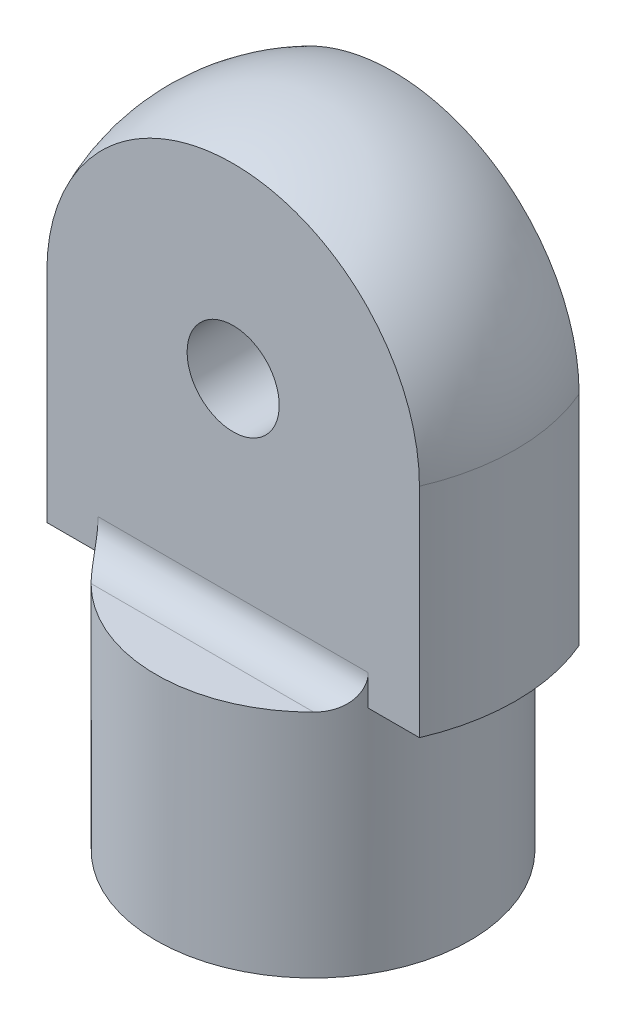
ISO-10303-21;
HEADER;
FILE_DESCRIPTION(('STEP AP214'),'2;1');
FILE_NAME('part.step','',(''),(''),'','','');
FILE_SCHEMA(('AUTOMOTIVE_DESIGN { 1 0 10303 214 1 1 1 1 }'));
ENDSEC;
DATA;
#1=APPLICATION_CONTEXT('core data for automotive mechanical design processes');
#2=APPLICATION_PROTOCOL_DEFINITION('international standard','automotive_design',2000,#1);
#3=PRODUCT_CONTEXT('',#1,'mechanical');
#4=PRODUCT('Part','Part','',(#3));
#5=PRODUCT_RELATED_PRODUCT_CATEGORY('part','',(#4));
#6=PRODUCT_DEFINITION_FORMATION('','',#4);
#7=PRODUCT_DEFINITION_CONTEXT('part definition',#1,'design');
#8=PRODUCT_DEFINITION('design','',#6,#7);
#9=PRODUCT_DEFINITION_SHAPE('','',#8);
#10=(LENGTH_UNIT() NAMED_UNIT(*) SI_UNIT(.MILLI.,.METRE.));
#11=(NAMED_UNIT(*) PLANE_ANGLE_UNIT() SI_UNIT($,.RADIAN.));
#12=(NAMED_UNIT(*) SI_UNIT($,.STERADIAN.) SOLID_ANGLE_UNIT());
#13=UNCERTAINTY_MEASURE_WITH_UNIT(LENGTH_MEASURE(1.E-05),#10,'distance_accuracy_value','');
#14=(GEOMETRIC_REPRESENTATION_CONTEXT(3) GLOBAL_UNCERTAINTY_ASSIGNED_CONTEXT((#13)) GLOBAL_UNIT_ASSIGNED_CONTEXT((#10,
#11,#12)) REPRESENTATION_CONTEXT('',''));
#15=CARTESIAN_POINT('',(0.,0.,0.));
#16=DIRECTION('',(0.,0.,1.));
#17=DIRECTION('',(1.,0.,0.));
#18=AXIS2_PLACEMENT_3D('',#15,#16,#17);
#19=CARTESIAN_POINT('',(0.,19.05,0.));
#20=DIRECTION('',(0.,-1.,0.));
#21=DIRECTION('',(0.,0.,-1.));
#22=AXIS2_PLACEMENT_3D('',#19,#20,#21);
#23=CYLINDRICAL_SURFACE('',#22,16.764);
#24=CARTESIAN_POINT('',(0.,37.0615688143395,0.));
#25=DIRECTION('',(0.,-1.,0.));
#26=DIRECTION('',(0.,0.,-1.));
#27=AXIS2_PLACEMENT_3D('',#24,#25,#26);
#28=CIRCLE('',#27,16.764);
#29=CARTESIAN_POINT('',(15.4084029023128,37.0615688143395,-6.604));
#30=VERTEX_POINT('',#29);
#31=CARTESIAN_POINT('',(15.4084029023128,37.0615688143395,6.604));
#32=VERTEX_POINT('',#31);
#33=EDGE_CURVE('E150',#30,#32,#28,.T.);
#34=ORIENTED_EDGE('',*,*,#33,.T.);
#35=DIRECTION('',(0.,-1.,0.));
#36=VECTOR('',#35,1.);
#37=CARTESIAN_POINT('',(15.4084029023127,19.05,6.604));
#38=LINE('',#37,#36);
#39=CARTESIAN_POINT('',(15.4084029023128,19.05,6.604));
#40=VERTEX_POINT('',#39);
#41=EDGE_CURVE('E142',#32,#40,#38,.T.);
#42=ORIENTED_EDGE('',*,*,#41,.T.);
#43=CARTESIAN_POINT('',(0.,19.05,0.));
#44=DIRECTION('',(0.,-1.,0.));
#45=DIRECTION('',(0.,0.,-1.));
#46=AXIS2_PLACEMENT_3D('',#43,#44,#45);
#47=CIRCLE('',#46,16.764);
#48=CARTESIAN_POINT('',(15.4084029023128,19.05,-6.604));
#49=VERTEX_POINT('',#48);
#50=EDGE_CURVE('E141',#49,#40,#47,.T.);
#51=ORIENTED_EDGE('',*,*,#50,.F.);
#52=DIRECTION('',(0.,-1.,0.));
#53=VECTOR('',#52,1.);
#54=CARTESIAN_POINT('',(15.4084029023128,19.05,-6.604));
#55=LINE('',#54,#53);
#56=EDGE_CURVE('E168',#49,#30,#55,.F.);
#57=ORIENTED_EDGE('',*,*,#56,.T.);
#58=EDGE_LOOP('',(#34,#42,#51,#57));
#59=FACE_BOUND('',#58,.T.);
#60=ADVANCED_FACE('F33',(#59),#23,.T.);
#61=CARTESIAN_POINT('',(0.,19.05,16.764));
#62=DIRECTION('',(0.,1.,0.));
#63=DIRECTION('',(0.,0.,1.));
#64=AXIS2_PLACEMENT_3D('',#61,#62,#63);
#65=PLANE('',#64);
#66=ORIENTED_EDGE('',*,*,#50,.T.);
#67=DIRECTION('',(-1.,0.,0.));
#68=VECTOR('',#67,1.);
#69=CARTESIAN_POINT('',(0.,19.05,6.604));
#70=LINE('',#69,#68);
#71=CARTESIAN_POINT('',(11.1737195400636,19.05,6.604));
#72=VERTEX_POINT('',#71);
#73=EDGE_CURVE('E164',#40,#72,#70,.T.);
#74=ORIENTED_EDGE('',*,*,#73,.T.);
#75=CARTESIAN_POINT('',(0.,19.05,0.));
#76=DIRECTION('',(0.,1.,0.));
#77=DIRECTION('',(0.,0.,1.));
#78=AXIS2_PLACEMENT_3D('',#75,#76,#77);
#79=CIRCLE('',#78,12.9794);
#80=CARTESIAN_POINT('',(11.1737195400636,19.05,-6.604));
#81=VERTEX_POINT('',#80);
#82=EDGE_CURVE('E154',#72,#81,#79,.T.);
#83=ORIENTED_EDGE('',*,*,#82,.T.);
#84=DIRECTION('',(1.,0.,0.));
#85=VECTOR('',#84,1.);
#86=CARTESIAN_POINT('',(0.,19.05,-6.604));
#87=LINE('',#86,#85);
#88=EDGE_CURVE('E126',#81,#49,#87,.T.);
#89=ORIENTED_EDGE('',*,*,#88,.T.);
#90=EDGE_LOOP('',(#66,#74,#83,#89));
#91=FACE_BOUND('',#90,.T.);
#92=ADVANCED_FACE('F215',(#91),#65,.F.);
#93=CARTESIAN_POINT('',(0.,19.05,0.));
#94=DIRECTION('',(0.,-1.,0.));
#95=DIRECTION('',(0.,0.,-1.));
#96=AXIS2_PLACEMENT_3D('',#93,#94,#95);
#97=CYLINDRICAL_SURFACE('',#96,12.9794);
#98=ORIENTED_EDGE('',*,*,#82,.F.);
#99=DIRECTION('',(0.,-1.,0.));
#100=VECTOR('',#99,1.);
#101=CARTESIAN_POINT('',(11.1737195400636,21.59,6.604));
#102=LINE('',#101,#100);
#103=CARTESIAN_POINT('',(11.1737195400636,21.59,6.604));
#104=VERTEX_POINT('',#103);
#105=EDGE_CURVE('E181',#104,#72,#102,.T.);
#106=ORIENTED_EDGE('',*,*,#105,.F.);
#107=CARTESIAN_POINT('',(11.1737195400636,21.59,6.604));
#108=CARTESIAN_POINT('',(11.1737215733515,21.5265407898862,6.60398935535812));
#109=CARTESIAN_POINT('',(11.1723139936164,21.4630864801311,6.60637795087207));
#110=CARTESIAN_POINT('',(11.1666963441772,21.3366709381351,6.61587278710055));
#111=CARTESIAN_POINT('',(11.1624869220927,21.2737095953514,6.62297793762664));
#112=CARTESIAN_POINT('',(11.1513017591938,21.1489504417422,6.64179240239289));
#113=CARTESIAN_POINT('',(11.1443356727992,21.0871493503745,6.65348564696111));
#114=CARTESIAN_POINT('',(11.1276762898658,20.9649460750755,6.68131021117566));
#115=CARTESIAN_POINT('',(11.1179829382894,20.9045439194022,6.69744162038615));
#116=CARTESIAN_POINT('',(11.0848786639251,20.7261176073252,6.75219441986443));
#117=CARTESIAN_POINT('',(11.0574288381731,20.6107096382099,6.79719969802229));
#118=CARTESIAN_POINT('',(10.9923119638442,20.3899868127129,6.90200567936843));
#119=CARTESIAN_POINT('',(10.9546388597796,20.2846779884856,6.96181514957632));
#120=CARTESIAN_POINT('',(10.868260768231,20.0825992792861,7.09593558962988));
#121=CARTESIAN_POINT('',(10.8192056770615,19.986276734222,7.17069328137976));
#122=CARTESIAN_POINT('',(10.711920094414,19.8080683149321,7.3299936146215));
#123=CARTESIAN_POINT('',(10.6536912808835,19.7261798063974,7.41453446594564));
#124=CARTESIAN_POINT('',(10.5217333092046,19.5684150280978,7.60081929226967));
#125=CARTESIAN_POINT('',(10.4469848013716,19.4944044493318,7.70341431990763));
#126=CARTESIAN_POINT('',(10.2886983969578,19.3644651551549,7.91358730874569));
#127=CARTESIAN_POINT('',(10.2051369600394,19.3085865807153,8.02117816275038));
#128=CARTESIAN_POINT('',(10.0494506022818,19.2241724965358,8.21494931286933));
#129=CARTESIAN_POINT('',(9.97867343952245,19.1923491538254,8.30081620902634));
#130=CARTESIAN_POINT('',(9.83327244307778,19.138701463706,8.47255846015439));
#131=CARTESIAN_POINT('',(9.75864483265789,19.1168871493993,8.55843373768028));
#132=CARTESIAN_POINT('',(9.60666075751741,19.0826888564086,8.72867815152028));
#133=CARTESIAN_POINT('',(9.52932284208018,19.0702503764724,8.81305316427712));
#134=CARTESIAN_POINT('',(9.37217962608396,19.05391922019,8.97999327389157));
#135=CARTESIAN_POINT('',(9.29237989759662,19.0500085020063,9.06256182524474));
#136=CARTESIAN_POINT('',(9.21151932962202,19.05,9.144));
#137=B_SPLINE_CURVE_WITH_KNOTS('',3,(#107,#108,#109,#110,#111,#112,#113,#114,#115,#116,#117,
#118,#119,#120,#121,#122,#123,#124,#125,#126,#127,#128,#129,#130,#131,#132,#133,#134,#135,#136),
.UNSPECIFIED.,.F.,.F.,(4,2,2,2,2,2,2,2,2,2,2,2,2,2,4),(0.,0.19030876138845,0.380573549960749,
0.570177806057979,0.759785888735379,1.13850876554972,1.51745646031555,1.91012743967642,
2.30272667956841,2.74190052029378,3.18227867186928,3.52899062172235,3.87604936220698,
4.2210747704534,4.56536951142442),.UNSPECIFIED.);
#138=CARTESIAN_POINT('',(9.21151932962202,19.05,9.144));
#139=VERTEX_POINT('',#138);
#140=EDGE_CURVE('E47',#104,#139,#137,.T.);
#141=ORIENTED_EDGE('',*,*,#140,.T.);
#142=CARTESIAN_POINT('',(-9.21151932962202,19.05,9.144));
#143=VERTEX_POINT('',#142);
#144=EDGE_CURVE('E158',#143,#139,#79,.T.);
#145=ORIENTED_EDGE('',*,*,#144,.F.);
#146=CARTESIAN_POINT('',(-9.21151932962202,19.05,9.144));
#147=CARTESIAN_POINT('',(-9.28684877218685,19.0500070242211,9.06812838961582));
#148=CARTESIAN_POINT('',(-9.36125421929603,19.0534014394328,8.99128449303218));
#149=CARTESIAN_POINT('',(-9.50793080026487,19.0675305394493,8.8360303345306));
#150=CARTESIAN_POINT('',(-9.58019847199863,19.0782765165705,8.75761784331495));
#151=CARTESIAN_POINT('',(-9.72266637939333,19.1077994094863,8.59918793597159));
#152=CARTESIAN_POINT('',(-9.79284453196604,19.1266421091711,8.5191626059475));
#153=CARTESIAN_POINT('',(-9.92996636505326,19.1729314114814,8.35893052525986));
#154=CARTESIAN_POINT('',(-9.99691207814926,19.2003725238575,8.27872392269605));
#155=CARTESIAN_POINT('',(-10.1640706949811,19.2826280271739,8.07356673634664));
#156=CARTESIAN_POINT('',(-10.2616290549579,19.3441415136587,7.94902614628663));
#157=CARTESIAN_POINT('',(-10.4451082201562,19.4912511862041,7.70633488919627));
#158=CARTESIAN_POINT('',(-10.531068941997,19.5767614780111,7.58816319159785));
#159=CARTESIAN_POINT('',(-10.6775928905408,19.7578522180787,7.38021537434764));
#160=CARTESIAN_POINT('',(-10.7400320340918,19.8500562697291,7.28882757391671));
#161=CARTESIAN_POINT('',(-10.8536663020337,20.0516988180007,7.11851394398465));
#162=CARTESIAN_POINT('',(-10.9048573035768,20.1611436088193,7.03959268688868));
#163=CARTESIAN_POINT('',(-10.9723007596352,20.3367614246828,6.93362983124986));
#164=CARTESIAN_POINT('',(-10.9932802587896,20.3974363754101,6.9002862638163));
#165=CARTESIAN_POINT('',(-11.0319282330376,20.5221481047471,6.83832677886499));
#166=CARTESIAN_POINT('',(-11.0495982894036,20.5861832590102,6.80970860430289));
#167=CARTESIAN_POINT('',(-11.0815042760653,20.7170972497852,6.75766390007577));
#168=CARTESIAN_POINT('',(-11.0957427828205,20.7839739081941,6.73423347645025));
#169=CARTESIAN_POINT('',(-11.1207105107784,20.9200216271941,6.69292186249175));
#170=CARTESIAN_POINT('',(-11.1314410139288,20.9891918394395,6.67503864513725));
#171=CARTESIAN_POINT('',(-11.1514639571528,21.1459497216208,6.64154743020641));
#172=CARTESIAN_POINT('',(-11.1598065009689,21.2340030709361,6.62749361298952));
#173=CARTESIAN_POINT('',(-11.1681520890102,21.3670144160924,6.613412764823));
#174=CARTESIAN_POINT('',(-11.1702392472267,21.4115093904322,6.60988579350548));
#175=CARTESIAN_POINT('',(-11.1730227054387,21.5006652748933,6.60517919900973));
#176=CARTESIAN_POINT('',(-11.1737190480764,21.5453261798851,6.60399950386426));
#177=CARTESIAN_POINT('',(-11.1737195400636,21.59,6.604));
#178=B_SPLINE_CURVE_WITH_KNOTS('',3,(#146,#147,#148,#149,#150,#151,#152,#153,#154,#155,#156,
#157,#158,#159,#160,#161,#162,#163,#164,#165,#166,#167,#168,#169,#170,#171,#172,#173,#174,#175,
#176,#177),.UNSPECIFIED.,.F.,.F.,(4,2,2,2,2,2,2,2,2,2,2,2,2,2,2,4),(0.,0.320743055616612,
0.641979895880251,0.965877577140258,1.28956886359833,1.7967531082092,2.3021445966807,
2.73255267181965,3.16311824477273,3.37988810311987,3.59655412176039,3.81305695391256,
4.02948057965427,4.29740703122271,4.43138598643297,4.5653608337986),.UNSPECIFIED.);
#179=CARTESIAN_POINT('',(-11.1737195400636,21.59,6.604));
#180=VERTEX_POINT('',#179);
#181=EDGE_CURVE('E11',#143,#180,#178,.T.);
#182=ORIENTED_EDGE('',*,*,#181,.T.);
#183=DIRECTION('',(0.,-1.,0.));
#184=VECTOR('',#183,1.);
#185=CARTESIAN_POINT('',(-11.1737195400636,19.05,6.604));
#186=LINE('',#185,#184);
#187=CARTESIAN_POINT('',(-11.1737195400636,19.05,6.604));
#188=VERTEX_POINT('',#187);
#189=EDGE_CURVE('E53',#188,#180,#186,.F.);
#190=ORIENTED_EDGE('',*,*,#189,.F.);
#191=CARTESIAN_POINT('',(-11.1737195400636,19.05,-6.604));
#192=VERTEX_POINT('',#191);
#193=EDGE_CURVE('E159',#192,#188,#79,.T.);
#194=ORIENTED_EDGE('',*,*,#193,.F.);
#195=DIRECTION('',(0.,-1.,0.));
#196=VECTOR('',#195,1.);
#197=CARTESIAN_POINT('',(-11.1737195400636,21.59,-6.604));
#198=LINE('',#197,#196);
#199=CARTESIAN_POINT('',(-11.1737195400636,21.59,-6.604));
#200=VERTEX_POINT('',#199);
#201=EDGE_CURVE('E121',#200,#192,#198,.T.);
#202=ORIENTED_EDGE('',*,*,#201,.F.);
#203=CARTESIAN_POINT('',(-11.1737195400636,21.59,-6.604));
#204=CARTESIAN_POINT('',(-11.1737215733515,21.5265407898862,-6.60398935535812));
#205=CARTESIAN_POINT('',(-11.1723139936164,21.4630864801311,-6.60637795087207));
#206=CARTESIAN_POINT('',(-11.1666963441772,21.3366709381351,-6.61587278710055));
#207=CARTESIAN_POINT('',(-11.1624869220927,21.2737095953514,-6.62297793762664));
#208=CARTESIAN_POINT('',(-11.1513017591938,21.1489504417422,-6.64179240239289));
#209=CARTESIAN_POINT('',(-11.1443356727992,21.0871493503745,-6.65348564696111));
#210=CARTESIAN_POINT('',(-11.1276762898658,20.9649460750755,-6.68131021117566));
#211=CARTESIAN_POINT('',(-11.1179829382894,20.9045439194022,-6.69744162038615));
#212=CARTESIAN_POINT('',(-11.0848786639251,20.7261176073252,-6.75219441986443));
#213=CARTESIAN_POINT('',(-11.0574288381731,20.6107096382099,-6.79719969802229));
#214=CARTESIAN_POINT('',(-10.9923119638442,20.3899868127129,-6.90200567936843));
#215=CARTESIAN_POINT('',(-10.9546388597796,20.2846779884856,-6.96181514957632));
#216=CARTESIAN_POINT('',(-10.868260768231,20.0825992792861,-7.09593558962988));
#217=CARTESIAN_POINT('',(-10.8192056770615,19.986276734222,-7.17069328137976));
#218=CARTESIAN_POINT('',(-10.711920094414,19.8080683149321,-7.3299936146215));
#219=CARTESIAN_POINT('',(-10.6536912808835,19.7261798063974,-7.41453446594564));
#220=CARTESIAN_POINT('',(-10.5217333092046,19.5684150280978,-7.60081929226967));
#221=CARTESIAN_POINT('',(-10.4469848013716,19.4944044493318,-7.70341431990763));
#222=CARTESIAN_POINT('',(-10.2886983969578,19.3644651551549,-7.91358730874569));
#223=CARTESIAN_POINT('',(-10.2051369600394,19.3085865807153,-8.02117816275038));
#224=CARTESIAN_POINT('',(-10.0494506022818,19.2241724965358,-8.21494931286933));
#225=CARTESIAN_POINT('',(-9.97867343952245,19.1923491538254,-8.30081620902634));
#226=CARTESIAN_POINT('',(-9.83327244307778,19.138701463706,-8.47255846015439));
#227=CARTESIAN_POINT('',(-9.75864483265789,19.1168871493993,-8.55843373768028));
#228=CARTESIAN_POINT('',(-9.60666075751741,19.0826888564086,-8.72867815152028));
#229=CARTESIAN_POINT('',(-9.52932284208018,19.0702503764724,-8.81305316427712));
#230=CARTESIAN_POINT('',(-9.37217962608396,19.05391922019,-8.97999327389157));
#231=CARTESIAN_POINT('',(-9.29237989759662,19.0500085020063,-9.06256182524474));
#232=CARTESIAN_POINT('',(-9.21151932962202,19.05,-9.144));
#233=B_SPLINE_CURVE_WITH_KNOTS('',3,(#203,#204,#205,#206,#207,#208,#209,#210,#211,#212,#213,
#214,#215,#216,#217,#218,#219,#220,#221,#222,#223,#224,#225,#226,#227,#228,#229,#230,#231,#232),
.UNSPECIFIED.,.F.,.F.,(4,2,2,2,2,2,2,2,2,2,2,2,2,2,4),(0.,0.19030876138845,0.380573549960749,
0.570177806057979,0.759785888735379,1.13850876554972,1.51745646031555,1.91012743967642,
2.30272667956841,2.74190052029378,3.18227867186928,3.52899062172235,3.87604936220698,
4.2210747704534,4.56536951142442),.UNSPECIFIED.);
#234=CARTESIAN_POINT('',(-9.21151932962202,19.05,-9.144));
#235=VERTEX_POINT('',#234);
#236=EDGE_CURVE('E191',#200,#235,#233,.T.);
#237=ORIENTED_EDGE('',*,*,#236,.T.);
#238=CARTESIAN_POINT('',(9.21151932962202,19.05,-9.144));
#239=VERTEX_POINT('',#238);
#240=EDGE_CURVE('E157',#239,#235,#79,.T.);
#241=ORIENTED_EDGE('',*,*,#240,.F.);
#242=CARTESIAN_POINT('',(9.21151932962202,19.05,-9.144));
#243=CARTESIAN_POINT('',(9.28684877218685,19.0500070242211,-9.06812838961582));
#244=CARTESIAN_POINT('',(9.36125421929603,19.0534014394328,-8.99128449303218));
#245=CARTESIAN_POINT('',(9.50793080026487,19.0675305394493,-8.8360303345306));
#246=CARTESIAN_POINT('',(9.58019847199863,19.0782765165705,-8.75761784331495));
#247=CARTESIAN_POINT('',(9.72266637939333,19.1077994094863,-8.59918793597159));
#248=CARTESIAN_POINT('',(9.79284453196604,19.1266421091711,-8.5191626059475));
#249=CARTESIAN_POINT('',(9.92996636505326,19.1729314114814,-8.35893052525986));
#250=CARTESIAN_POINT('',(9.99691207814926,19.2003725238575,-8.27872392269605));
#251=CARTESIAN_POINT('',(10.1640706949811,19.2826280271739,-8.07356673634664));
#252=CARTESIAN_POINT('',(10.2616290549579,19.3441415136587,-7.94902614628663));
#253=CARTESIAN_POINT('',(10.4451082201562,19.4912511862041,-7.70633488919627));
#254=CARTESIAN_POINT('',(10.531068941997,19.5767614780111,-7.58816319159785));
#255=CARTESIAN_POINT('',(10.6775928905408,19.7578522180787,-7.38021537434764));
#256=CARTESIAN_POINT('',(10.7400320340918,19.8500562697291,-7.28882757391671));
#257=CARTESIAN_POINT('',(10.8536663020337,20.0516988180007,-7.11851394398465));
#258=CARTESIAN_POINT('',(10.9048573035768,20.1611436088193,-7.03959268688868));
#259=CARTESIAN_POINT('',(10.9723007596352,20.3367614246828,-6.93362983124986));
#260=CARTESIAN_POINT('',(10.9932802587896,20.3974363754101,-6.9002862638163));
#261=CARTESIAN_POINT('',(11.0319282330376,20.5221481047471,-6.83832677886499));
#262=CARTESIAN_POINT('',(11.0495982894036,20.5861832590102,-6.80970860430289));
#263=CARTESIAN_POINT('',(11.0815042760653,20.7170972497852,-6.75766390007577));
#264=CARTESIAN_POINT('',(11.0957427828205,20.7839739081941,-6.73423347645025));
#265=CARTESIAN_POINT('',(11.1207105107784,20.9200216271941,-6.69292186249175));
#266=CARTESIAN_POINT('',(11.1314410139288,20.9891918394395,-6.67503864513725));
#267=CARTESIAN_POINT('',(11.1514639571528,21.1459497216208,-6.64154743020641));
#268=CARTESIAN_POINT('',(11.1598065009689,21.2340030709361,-6.62749361298952));
#269=CARTESIAN_POINT('',(11.1681520890102,21.3670144160924,-6.613412764823));
#270=CARTESIAN_POINT('',(11.1702392472267,21.4115093904322,-6.60988579350548));
#271=CARTESIAN_POINT('',(11.1730227054387,21.5006652748933,-6.60517919900973));
#272=CARTESIAN_POINT('',(11.1737190480764,21.5453261798851,-6.60399950386426));
#273=CARTESIAN_POINT('',(11.1737195400636,21.59,-6.604));
#274=B_SPLINE_CURVE_WITH_KNOTS('',3,(#242,#243,#244,#245,#246,#247,#248,#249,#250,#251,#252,
#253,#254,#255,#256,#257,#258,#259,#260,#261,#262,#263,#264,#265,#266,#267,#268,#269,#270,#271,
#272,#273),.UNSPECIFIED.,.F.,.F.,(4,2,2,2,2,2,2,2,2,2,2,2,2,2,2,4),(0.,0.320743055616612,
0.641979895880251,0.965877577140258,1.28956886359833,1.7967531082092,2.3021445966807,
2.73255267181965,3.16311824477273,3.37988810311987,3.59655412176039,3.81305695391256,
4.02948057965427,4.29740703122271,4.43138598643297,4.5653608337986),.UNSPECIFIED.);
#275=CARTESIAN_POINT('',(11.1737195400636,21.59,-6.604));
#276=VERTEX_POINT('',#275);
#277=EDGE_CURVE('E185',#239,#276,#274,.T.);
#278=ORIENTED_EDGE('',*,*,#277,.T.);
#279=DIRECTION('',(0.,-1.,0.));
#280=VECTOR('',#279,1.);
#281=CARTESIAN_POINT('',(11.1737195400636,19.05,-6.604));
#282=LINE('',#281,#280);
#283=EDGE_CURVE('E60',#81,#276,#282,.F.);
#284=ORIENTED_EDGE('',*,*,#283,.F.);
#285=EDGE_LOOP('',(#98,#106,#141,#145,#182,#190,#194,#202,#237,#241,#278,#284));
#286=FACE_BOUND('',#285,.T.);
#287=CARTESIAN_POINT('',(0.,0.,0.));
#288=DIRECTION('',(0.,1.,0.));
#289=DIRECTION('',(0.,0.,1.));
#290=AXIS2_PLACEMENT_3D('',#287,#288,#289);
#291=CIRCLE('',#290,12.9794);
#292=CARTESIAN_POINT('',(0.,0.,12.9794));
#293=VERTEX_POINT('',#292);
#294=EDGE_CURVE('E153',#293,#293,#291,.T.);
#295=ORIENTED_EDGE('',*,*,#294,.T.);
#296=EDGE_LOOP('',(#295));
#297=FACE_BOUND('',#296,.T.);
#298=ADVANCED_FACE('F196',(#286,#297),#97,.T.);
#299=CARTESIAN_POINT('',(0.,0.,0.));
#300=DIRECTION('',(0.,1.,0.));
#301=DIRECTION('',(0.,0.,1.));
#302=AXIS2_PLACEMENT_3D('',#299,#300,#301);
#303=PLANE('',#302);
#304=ORIENTED_EDGE('',*,*,#294,.F.);
#305=EDGE_LOOP('',(#304));
#306=FACE_BOUND('',#305,.T.);
#307=ADVANCED_FACE('F231',(#306),#303,.F.);
#308=CARTESIAN_POINT('',(0.,37.0615688143396,0.));
#309=DIRECTION('',(0.,-1.,0.));
#310=DIRECTION('',(0.,0.,-1.));
#311=AXIS2_PLACEMENT_3D('',#308,#309,#310);
#312=SPHERICAL_SURFACE('',#311,16.764);
#313=CARTESIAN_POINT('',(-15.4084029023127,37.0615688143395,6.604));
#314=VERTEX_POINT('',#313);
#315=CARTESIAN_POINT('',(-15.4084029023128,37.0615688143395,-6.604));
#316=VERTEX_POINT('',#315);
#317=EDGE_CURVE('E135',#314,#316,#28,.T.);
#318=ORIENTED_EDGE('',*,*,#317,.F.);
#319=CARTESIAN_POINT('',(0.,37.0615688143396,6.604));
#320=DIRECTION('',(0.,0.,-1.));
#321=DIRECTION('',(-1.,0.,0.));
#322=AXIS2_PLACEMENT_3D('',#319,#320,#321);
#323=CIRCLE('',#322,15.4084029023128);
#324=EDGE_CURVE('E146',#314,#32,#323,.T.);
#325=ORIENTED_EDGE('',*,*,#324,.T.);
#326=ORIENTED_EDGE('',*,*,#33,.F.);
#327=CARTESIAN_POINT('',(0.,37.0615688143396,-6.604));
#328=DIRECTION('',(0.,0.,1.));
#329=DIRECTION('',(1.,0.,0.));
#330=AXIS2_PLACEMENT_3D('',#327,#328,#329);
#331=CIRCLE('',#330,15.4084029023128);
#332=EDGE_CURVE('E137',#30,#316,#331,.T.);
#333=ORIENTED_EDGE('',*,*,#332,.T.);
#334=EDGE_LOOP('',(#318,#325,#326,#333));
#335=FACE_BOUND('',#334,.T.);
#336=ADVANCED_FACE('F225',(#335),#312,.T.);
#337=CARTESIAN_POINT('',(-15.4084029023128,19.05,6.604));
#338=VERTEX_POINT('',#337);
#339=CARTESIAN_POINT('',(-15.4084029023128,19.05,-6.604));
#340=VERTEX_POINT('',#339);
#341=EDGE_CURVE('E133',#338,#340,#47,.T.);
#342=ORIENTED_EDGE('',*,*,#341,.F.);
#343=DIRECTION('',(0.,-1.,0.));
#344=VECTOR('',#343,1.);
#345=CARTESIAN_POINT('',(-15.4084029023127,19.05,6.604));
#346=LINE('',#345,#344);
#347=EDGE_CURVE('E136',#338,#314,#346,.F.);
#348=ORIENTED_EDGE('',*,*,#347,.T.);
#349=ORIENTED_EDGE('',*,*,#317,.T.);
#350=DIRECTION('',(0.,-1.,0.));
#351=VECTOR('',#350,1.);
#352=CARTESIAN_POINT('',(-15.4084029023128,19.05,-6.604));
#353=LINE('',#352,#351);
#354=EDGE_CURVE('E118',#316,#340,#353,.T.);
#355=ORIENTED_EDGE('',*,*,#354,.T.);
#356=EDGE_LOOP('',(#342,#348,#349,#355));
#357=FACE_BOUND('',#356,.T.);
#358=ADVANCED_FACE('F131',(#357),#23,.T.);
#359=ORIENTED_EDGE('',*,*,#193,.T.);
#360=EDGE_CURVE('E125',#188,#338,#70,.T.);
#361=ORIENTED_EDGE('',*,*,#360,.T.);
#362=ORIENTED_EDGE('',*,*,#341,.T.);
#363=EDGE_CURVE('E115',#340,#192,#87,.T.);
#364=ORIENTED_EDGE('',*,*,#363,.T.);
#365=EDGE_LOOP('',(#359,#361,#362,#364));
#366=FACE_BOUND('',#365,.T.);
#367=ADVANCED_FACE('F140',(#366),#65,.F.);
#368=CARTESIAN_POINT('',(-16.764,19.05,-6.604));
#369=DIRECTION('',(0.,-1.,0.));
#370=DIRECTION('',(0.,0.,-1.));
#371=AXIS2_PLACEMENT_3D('',#368,#369,#370);
#372=PLANE('',#371);
#373=ORIENTED_EDGE('',*,*,#240,.T.);
#374=DIRECTION('',(1.,0.,0.));
#375=VECTOR('',#374,1.);
#376=CARTESIAN_POINT('',(11.1737195400636,19.05,-9.144));
#377=LINE('',#376,#375);
#378=EDGE_CURVE('E170',#235,#239,#377,.T.);
#379=ORIENTED_EDGE('',*,*,#378,.T.);
#380=EDGE_LOOP('',(#373,#379));
#381=FACE_BOUND('',#380,.T.);
#382=ADVANCED_FACE('F230',(#381),#372,.F.);
#383=CARTESIAN_POINT('',(-16.764,19.05,-6.604));
#384=DIRECTION('',(0.,0.,1.));
#385=DIRECTION('',(1.,0.,0.));
#386=AXIS2_PLACEMENT_3D('',#383,#384,#385);
#387=PLANE('',#386);
#388=CARTESIAN_POINT('',(0.,37.0615688143396,-6.604));
#389=DIRECTION('',(0.,0.,-1.));
#390=DIRECTION('',(-1.,0.,0.));
#391=AXIS2_PLACEMENT_3D('',#388,#389,#390);
#392=CIRCLE('',#391,3.81);
#393=CARTESIAN_POINT('',(-3.81,37.0615688143396,-6.604));
#394=VERTEX_POINT('',#393);
#395=EDGE_CURVE('E169',#394,#394,#392,.T.);
#396=ORIENTED_EDGE('',*,*,#395,.F.);
#397=EDGE_LOOP('',(#396));
#398=FACE_BOUND('',#397,.T.);
#399=ORIENTED_EDGE('',*,*,#88,.F.);
#400=ORIENTED_EDGE('',*,*,#283,.T.);
#401=DIRECTION('',(1.,0.,0.));
#402=VECTOR('',#401,1.);
#403=CARTESIAN_POINT('',(-11.1737195400636,21.59,-6.604));
#404=LINE('',#403,#402);
#405=EDGE_CURVE('E174',#276,#200,#404,.F.);
#406=ORIENTED_EDGE('',*,*,#405,.T.);
#407=ORIENTED_EDGE('',*,*,#201,.T.);
#408=ORIENTED_EDGE('',*,*,#363,.F.);
#409=ORIENTED_EDGE('',*,*,#354,.F.);
#410=ORIENTED_EDGE('',*,*,#332,.F.);
#411=ORIENTED_EDGE('',*,*,#56,.F.);
#412=EDGE_LOOP('',(#399,#400,#406,#407,#408,#409,#410,#411));
#413=FACE_BOUND('',#412,.T.);
#414=ADVANCED_FACE('F117',(#398,#413),#387,.F.);
#415=CARTESIAN_POINT('',(-16.764,19.05,6.604));
#416=DIRECTION('',(0.,-1.,0.));
#417=DIRECTION('',(0.,0.,-1.));
#418=AXIS2_PLACEMENT_3D('',#415,#416,#417);
#419=PLANE('',#418);
#420=ORIENTED_EDGE('',*,*,#144,.T.);
#421=DIRECTION('',(1.,0.,0.));
#422=VECTOR('',#421,1.);
#423=CARTESIAN_POINT('',(-11.1737195400636,19.05,9.144));
#424=LINE('',#423,#422);
#425=EDGE_CURVE('E183',#139,#143,#424,.F.);
#426=ORIENTED_EDGE('',*,*,#425,.T.);
#427=EDGE_LOOP('',(#420,#426));
#428=FACE_BOUND('',#427,.T.);
#429=ADVANCED_FACE('F263',(#428),#419,.F.);
#430=CARTESIAN_POINT('',(-16.764,19.05,6.604));
#431=DIRECTION('',(0.,0.,-1.));
#432=DIRECTION('',(-1.,0.,0.));
#433=AXIS2_PLACEMENT_3D('',#430,#431,#432);
#434=PLANE('',#433);
#435=CARTESIAN_POINT('',(0.,37.0615688143396,6.604));
#436=DIRECTION('',(0.,0.,-1.));
#437=DIRECTION('',(-1.,0.,0.));
#438=AXIS2_PLACEMENT_3D('',#435,#436,#437);
#439=CIRCLE('',#438,3.81);
#440=CARTESIAN_POINT('',(-3.81,37.0615688143396,6.604));
#441=VERTEX_POINT('',#440);
#442=EDGE_CURVE('E165',#441,#441,#439,.T.);
#443=ORIENTED_EDGE('',*,*,#442,.T.);
#444=EDGE_LOOP('',(#443));
#445=FACE_BOUND('',#444,.T.);
#446=DIRECTION('',(1.,0.,0.));
#447=VECTOR('',#446,1.);
#448=CARTESIAN_POINT('',(11.1737195400636,21.59,6.604));
#449=LINE('',#448,#447);
#450=EDGE_CURVE('E178',#180,#104,#449,.T.);
#451=ORIENTED_EDGE('',*,*,#450,.T.);
#452=ORIENTED_EDGE('',*,*,#105,.T.);
#453=ORIENTED_EDGE('',*,*,#73,.F.);
#454=ORIENTED_EDGE('',*,*,#41,.F.);
#455=ORIENTED_EDGE('',*,*,#324,.F.);
#456=ORIENTED_EDGE('',*,*,#347,.F.);
#457=ORIENTED_EDGE('',*,*,#360,.F.);
#458=ORIENTED_EDGE('',*,*,#189,.T.);
#459=EDGE_LOOP('',(#451,#452,#453,#454,#455,#456,#457,#458));
#460=FACE_BOUND('',#459,.T.);
#461=ADVANCED_FACE('F210',(#445,#460),#434,.F.);
#462=CARTESIAN_POINT('',(0.,37.0615688143396,12.9794));
#463=DIRECTION('',(0.,0.,-1.));
#464=DIRECTION('',(-1.,0.,0.));
#465=AXIS2_PLACEMENT_3D('',#462,#463,#464);
#466=CYLINDRICAL_SURFACE('',#465,3.81);
#467=ORIENTED_EDGE('',*,*,#395,.T.);
#468=EDGE_LOOP('',(#467));
#469=FACE_BOUND('',#468,.T.);
#470=ORIENTED_EDGE('',*,*,#442,.F.);
#471=EDGE_LOOP('',(#470));
#472=FACE_BOUND('',#471,.T.);
#473=ADVANCED_FACE('F202',(#469,#472),#466,.F.);
#474=CARTESIAN_POINT('',(-16.764,21.59,-9.144));
#475=DIRECTION('',(-1.,0.,0.));
#476=DIRECTION('',(0.,0.,1.));
#477=AXIS2_PLACEMENT_3D('',#474,#475,#476);
#478=CYLINDRICAL_SURFACE('',#477,2.54);
#479=ORIENTED_EDGE('',*,*,#236,.F.);
#480=ORIENTED_EDGE('',*,*,#405,.F.);
#481=ORIENTED_EDGE('',*,*,#277,.F.);
#482=ORIENTED_EDGE('',*,*,#378,.F.);
#483=EDGE_LOOP('',(#479,#480,#481,#482));
#484=FACE_BOUND('',#483,.T.);
#485=ADVANCED_FACE('F199',(#484),#478,.F.);
#486=CARTESIAN_POINT('',(-16.764,21.59,9.144));
#487=DIRECTION('',(-1.,0.,0.));
#488=DIRECTION('',(0.,0.,1.));
#489=AXIS2_PLACEMENT_3D('',#486,#487,#488);
#490=CYLINDRICAL_SURFACE('',#489,2.54);
#491=ORIENTED_EDGE('',*,*,#181,.F.);
#492=ORIENTED_EDGE('',*,*,#425,.F.);
#493=ORIENTED_EDGE('',*,*,#140,.F.);
#494=ORIENTED_EDGE('',*,*,#450,.F.);
#495=EDGE_LOOP('',(#491,#492,#493,#494));
#496=FACE_BOUND('',#495,.T.);
#497=ADVANCED_FACE('F35',(#496),#490,.F.);
#498=CLOSED_SHELL('',(#60,#92,#298,#307,#336,#358,#367,#382,#414,#429,#461,#473,#485,#497));
#499=MANIFOLD_SOLID_BREP('B2',#498);
#500=ADVANCED_BREP_SHAPE_REPRESENTATION('',(#18,#499),#14);
#501=SHAPE_DEFINITION_REPRESENTATION(#9,#500);
ENDSEC;
END-ISO-10303-21;
